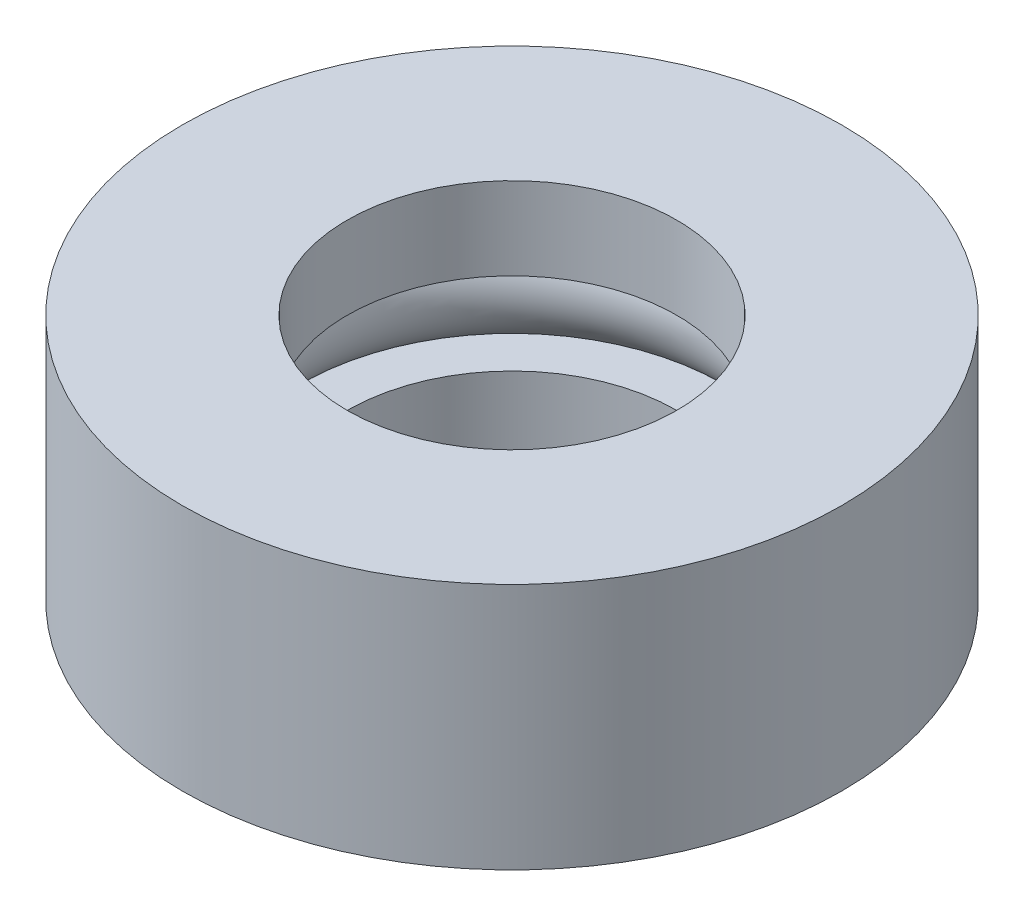
ISO-10303-21;
HEADER;
FILE_DESCRIPTION(('STEP AP214'),'2;1');
FILE_NAME('part.step','',(''),(''),'','','');
FILE_SCHEMA(('AUTOMOTIVE_DESIGN { 1 0 10303 214 1 1 1 1 }'));
ENDSEC;
DATA;
#1=APPLICATION_CONTEXT('core data for automotive mechanical design processes');
#2=APPLICATION_PROTOCOL_DEFINITION('international standard','automotive_design',2000,#1);
#3=PRODUCT_CONTEXT('',#1,'mechanical');
#4=PRODUCT('Part','Part','',(#3));
#5=PRODUCT_RELATED_PRODUCT_CATEGORY('part','',(#4));
#6=PRODUCT_DEFINITION_FORMATION('','',#4);
#7=PRODUCT_DEFINITION_CONTEXT('part definition',#1,'design');
#8=PRODUCT_DEFINITION('design','',#6,#7);
#9=PRODUCT_DEFINITION_SHAPE('','',#8);
#10=(LENGTH_UNIT() NAMED_UNIT(*) SI_UNIT(.MILLI.,.METRE.));
#11=(NAMED_UNIT(*) PLANE_ANGLE_UNIT() SI_UNIT($,.RADIAN.));
#12=(NAMED_UNIT(*) SI_UNIT($,.STERADIAN.) SOLID_ANGLE_UNIT());
#13=UNCERTAINTY_MEASURE_WITH_UNIT(LENGTH_MEASURE(1.E-05),#10,'distance_accuracy_value','');
#14=(GEOMETRIC_REPRESENTATION_CONTEXT(3) GLOBAL_UNCERTAINTY_ASSIGNED_CONTEXT((#13)) GLOBAL_UNIT_ASSIGNED_CONTEXT((#10,
#11,#12)) REPRESENTATION_CONTEXT('',''));
#15=CARTESIAN_POINT('',(0.,0.,0.));
#16=DIRECTION('',(0.,0.,1.));
#17=DIRECTION('',(1.,0.,0.));
#18=AXIS2_PLACEMENT_3D('',#15,#16,#17);
#19=CARTESIAN_POINT('',(0.,0.,0.));
#20=DIRECTION('',(0.,1.,0.));
#21=DIRECTION('',(0.,0.,1.));
#22=AXIS2_PLACEMENT_3D('',#19,#20,#21);
#23=TOROIDAL_SURFACE('',#22,4.5,1.);
#24=CARTESIAN_POINT('',(0.,0.75,0.));
#25=DIRECTION('',(0.,-1.,0.));
#26=DIRECTION('',(0.,0.,-1.));
#27=AXIS2_PLACEMENT_3D('',#24,#25,#26);
#28=CIRCLE('',#27,3.83856217223385);
#29=CARTESIAN_POINT('',(0.,0.75,-3.83856217223385));
#30=VERTEX_POINT('',#29);
#31=EDGE_CURVE('E49',#30,#30,#28,.F.);
#32=ORIENTED_EDGE('',*,*,#31,.T.);
#33=EDGE_LOOP('',(#32));
#34=FACE_BOUND('',#33,.T.);
#35=CARTESIAN_POINT('',(0.,-0.75,0.));
#36=DIRECTION('',(0.,1.,0.));
#37=DIRECTION('',(0.,0.,1.));
#38=AXIS2_PLACEMENT_3D('',#35,#36,#37);
#39=CIRCLE('',#38,3.83856217223385);
#40=CARTESIAN_POINT('',(0.,-0.75,3.83856217223385));
#41=VERTEX_POINT('',#40);
#42=EDGE_CURVE('E55',#41,#41,#39,.F.);
#43=ORIENTED_EDGE('',*,*,#42,.T.);
#44=EDGE_LOOP('',(#43));
#45=FACE_BOUND('',#44,.T.);
#46=ADVANCED_FACE('F31',(#34,#45),#23,.T.);
#47=CARTESIAN_POINT('',(0.,-0.75,0.));
#48=DIRECTION('',(0.,1.,0.));
#49=DIRECTION('',(0.,0.,1.));
#50=AXIS2_PLACEMENT_3D('',#47,#48,#49);
#51=CYLINDRICAL_SURFACE('',#50,6.);
#52=CARTESIAN_POINT('',(0.,2.25,0.));
#53=DIRECTION('',(0.,1.,0.));
#54=DIRECTION('',(0.,0.,1.));
#55=AXIS2_PLACEMENT_3D('',#52,#53,#54);
#56=CIRCLE('',#55,6.);
#57=CARTESIAN_POINT('',(0.,2.25,6.));
#58=VERTEX_POINT('',#57);
#59=EDGE_CURVE('E53',#58,#58,#56,.T.);
#60=ORIENTED_EDGE('',*,*,#59,.F.);
#61=EDGE_LOOP('',(#60));
#62=FACE_BOUND('',#61,.T.);
#63=CARTESIAN_POINT('',(0.,-2.25,0.));
#64=DIRECTION('',(0.,-1.,0.));
#65=DIRECTION('',(0.,0.,-1.));
#66=AXIS2_PLACEMENT_3D('',#63,#64,#65);
#67=CIRCLE('',#66,6.);
#68=CARTESIAN_POINT('',(0.,-2.25,-6.));
#69=VERTEX_POINT('',#68);
#70=EDGE_CURVE('E57',#69,#69,#67,.T.);
#71=ORIENTED_EDGE('',*,*,#70,.F.);
#72=EDGE_LOOP('',(#71));
#73=FACE_BOUND('',#72,.T.);
#74=ADVANCED_FACE('F114',(#62,#73),#51,.T.);
#75=CARTESIAN_POINT('',(0.,2.25,0.));
#76=DIRECTION('',(0.,-1.,0.));
#77=DIRECTION('',(0.,0.,-1.));
#78=AXIS2_PLACEMENT_3D('',#75,#76,#77);
#79=CYLINDRICAL_SURFACE('',#78,3.);
#80=CARTESIAN_POINT('',(0.,2.25,0.));
#81=DIRECTION('',(0.,1.,0.));
#82=DIRECTION('',(0.,0.,1.));
#83=AXIS2_PLACEMENT_3D('',#80,#81,#82);
#84=CIRCLE('',#83,3.);
#85=CARTESIAN_POINT('',(0.,2.25,3.));
#86=VERTEX_POINT('',#85);
#87=EDGE_CURVE('E72',#86,#86,#84,.T.);
#88=ORIENTED_EDGE('',*,*,#87,.T.);
#89=EDGE_LOOP('',(#88));
#90=FACE_BOUND('',#89,.T.);
#91=CARTESIAN_POINT('',(0.,0.75,0.));
#92=DIRECTION('',(0.,1.,0.));
#93=DIRECTION('',(0.,0.,1.));
#94=AXIS2_PLACEMENT_3D('',#91,#92,#93);
#95=CIRCLE('',#94,3.);
#96=CARTESIAN_POINT('',(0.,0.75,3.));
#97=VERTEX_POINT('',#96);
#98=EDGE_CURVE('E75',#97,#97,#95,.T.);
#99=ORIENTED_EDGE('',*,*,#98,.F.);
#100=EDGE_LOOP('',(#99));
#101=FACE_BOUND('',#100,.T.);
#102=ADVANCED_FACE('F119',(#90,#101),#79,.F.);
#103=CARTESIAN_POINT('',(0.,2.25,0.));
#104=DIRECTION('',(0.,1.,0.));
#105=DIRECTION('',(0.,0.,1.));
#106=AXIS2_PLACEMENT_3D('',#103,#104,#105);
#107=PLANE('',#106);
#108=ORIENTED_EDGE('',*,*,#59,.T.);
#109=EDGE_LOOP('',(#108));
#110=FACE_BOUND('',#109,.T.);
#111=ORIENTED_EDGE('',*,*,#87,.F.);
#112=EDGE_LOOP('',(#111));
#113=FACE_BOUND('',#112,.T.);
#114=ADVANCED_FACE('F125',(#110,#113),#107,.T.);
#115=CARTESIAN_POINT('',(0.,0.75,0.));
#116=DIRECTION('',(0.,1.,0.));
#117=DIRECTION('',(0.,0.,1.));
#118=AXIS2_PLACEMENT_3D('',#115,#116,#117);
#119=PLANE('',#118);
#120=ORIENTED_EDGE('',*,*,#98,.T.);
#121=EDGE_LOOP('',(#120));
#122=FACE_BOUND('',#121,.T.);
#123=ORIENTED_EDGE('',*,*,#31,.F.);
#124=EDGE_LOOP('',(#123));
#125=FACE_BOUND('',#124,.T.);
#126=ADVANCED_FACE('F98',(#122,#125),#119,.F.);
#127=CARTESIAN_POINT('',(0.,-2.25,0.));
#128=DIRECTION('',(0.,1.,0.));
#129=DIRECTION('',(0.,0.,1.));
#130=AXIS2_PLACEMENT_3D('',#127,#128,#129);
#131=CYLINDRICAL_SURFACE('',#130,3.);
#132=CARTESIAN_POINT('',(0.,-2.25,0.));
#133=DIRECTION('',(0.,-1.,0.));
#134=DIRECTION('',(0.,0.,-1.));
#135=AXIS2_PLACEMENT_3D('',#132,#133,#134);
#136=CIRCLE('',#135,3.);
#137=CARTESIAN_POINT('',(0.,-2.25,-3.));
#138=VERTEX_POINT('',#137);
#139=EDGE_CURVE('E63',#138,#138,#136,.T.);
#140=ORIENTED_EDGE('',*,*,#139,.T.);
#141=EDGE_LOOP('',(#140));
#142=FACE_BOUND('',#141,.T.);
#143=CARTESIAN_POINT('',(0.,-0.75,0.));
#144=DIRECTION('',(0.,-1.,0.));
#145=DIRECTION('',(0.,0.,-1.));
#146=AXIS2_PLACEMENT_3D('',#143,#144,#145);
#147=CIRCLE('',#146,3.);
#148=CARTESIAN_POINT('',(0.,-0.75,-3.));
#149=VERTEX_POINT('',#148);
#150=EDGE_CURVE('E68',#149,#149,#147,.T.);
#151=ORIENTED_EDGE('',*,*,#150,.F.);
#152=EDGE_LOOP('',(#151));
#153=FACE_BOUND('',#152,.T.);
#154=ADVANCED_FACE('F124',(#142,#153),#131,.F.);
#155=CARTESIAN_POINT('',(0.,-2.25,0.));
#156=DIRECTION('',(0.,-1.,0.));
#157=DIRECTION('',(0.,0.,-1.));
#158=AXIS2_PLACEMENT_3D('',#155,#156,#157);
#159=PLANE('',#158);
#160=ORIENTED_EDGE('',*,*,#70,.T.);
#161=EDGE_LOOP('',(#160));
#162=FACE_BOUND('',#161,.T.);
#163=ORIENTED_EDGE('',*,*,#139,.F.);
#164=EDGE_LOOP('',(#163));
#165=FACE_BOUND('',#164,.T.);
#166=ADVANCED_FACE('F131',(#162,#165),#159,.T.);
#167=CARTESIAN_POINT('',(0.,-0.75,0.));
#168=DIRECTION('',(0.,-1.,0.));
#169=DIRECTION('',(0.,0.,-1.));
#170=AXIS2_PLACEMENT_3D('',#167,#168,#169);
#171=PLANE('',#170);
#172=ORIENTED_EDGE('',*,*,#150,.T.);
#173=EDGE_LOOP('',(#172));
#174=FACE_BOUND('',#173,.T.);
#175=ORIENTED_EDGE('',*,*,#42,.F.);
#176=EDGE_LOOP('',(#175));
#177=FACE_BOUND('',#176,.T.);
#178=ADVANCED_FACE('F143',(#174,#177),#171,.F.);
#179=CLOSED_SHELL('',(#46,#74,#102,#114,#126,#154,#166,#178));
#180=CARTESIAN_POINT('',(0.,-0.661437827766146,0.));
#181=DIRECTION('',(0.,1.,0.));
#182=DIRECTION('',(0.,0.,1.));
#183=AXIS2_PLACEMENT_3D('',#180,#181,#182);
#184=CIRCLE('',#183,5.25);
#185=CARTESIAN_POINT('',(0.,-0.661437827766146,5.25));
#186=VERTEX_POINT('',#185);
#187=EDGE_CURVE('E40',#186,#186,#184,.T.);
#188=ORIENTED_EDGE('',*,*,#187,.F.);
#189=EDGE_LOOP('',(#188));
#190=FACE_BOUND('',#189,.T.);
#191=CARTESIAN_POINT('',(0.,-0.75,0.));
#192=DIRECTION('',(0.,-1.,0.));
#193=DIRECTION('',(0.,0.,-1.));
#194=AXIS2_PLACEMENT_3D('',#191,#192,#193);
#195=CIRCLE('',#194,5.16143782776615);
#196=CARTESIAN_POINT('',(0.,-0.75,-5.16143782776615));
#197=VERTEX_POINT('',#196);
#198=EDGE_CURVE('E35',#197,#197,#195,.F.);
#199=ORIENTED_EDGE('',*,*,#198,.T.);
#200=EDGE_LOOP('',(#199));
#201=FACE_BOUND('',#200,.T.);
#202=ADVANCED_FACE('F100',(#190,#201),#23,.T.);
#203=CARTESIAN_POINT('',(0.,-0.75,0.));
#204=DIRECTION('',(0.,1.,0.));
#205=DIRECTION('',(0.,0.,1.));
#206=AXIS2_PLACEMENT_3D('',#203,#204,#205);
#207=CYLINDRICAL_SURFACE('',#206,5.25);
#208=ORIENTED_EDGE('',*,*,#187,.T.);
#209=EDGE_LOOP('',(#208));
#210=FACE_BOUND('',#209,.T.);
#211=CARTESIAN_POINT('',(0.,-0.75,0.));
#212=DIRECTION('',(0.,-1.,0.));
#213=DIRECTION('',(0.,0.,-1.));
#214=AXIS2_PLACEMENT_3D('',#211,#212,#213);
#215=CIRCLE('',#214,5.25);
#216=CARTESIAN_POINT('',(0.,-0.75,-5.25));
#217=VERTEX_POINT('',#216);
#218=EDGE_CURVE('E61',#217,#217,#215,.T.);
#219=ORIENTED_EDGE('',*,*,#218,.T.);
#220=EDGE_LOOP('',(#219));
#221=FACE_BOUND('',#220,.T.);
#222=ADVANCED_FACE('F91',(#210,#221),#207,.F.);
#223=ORIENTED_EDGE('',*,*,#198,.F.);
#224=EDGE_LOOP('',(#223));
#225=FACE_BOUND('',#224,.T.);
#226=ORIENTED_EDGE('',*,*,#218,.F.);
#227=EDGE_LOOP('',(#226));
#228=FACE_BOUND('',#227,.T.);
#229=ADVANCED_FACE('F102',(#225,#228),#171,.F.);
#230=CLOSED_SHELL('',(#202,#222,#229));
#231=CARTESIAN_POINT('',(0.,0.661437827766146,0.));
#232=DIRECTION('',(0.,-1.,0.));
#233=DIRECTION('',(0.,0.,-1.));
#234=AXIS2_PLACEMENT_3D('',#231,#232,#233);
#235=CIRCLE('',#234,5.25);
#236=CARTESIAN_POINT('',(0.,0.661437827766146,-5.25));
#237=VERTEX_POINT('',#236);
#238=EDGE_CURVE('E10',#237,#237,#235,.T.);
#239=ORIENTED_EDGE('',*,*,#238,.F.);
#240=EDGE_LOOP('',(#239));
#241=FACE_BOUND('',#240,.T.);
#242=CARTESIAN_POINT('',(0.,0.75,0.));
#243=DIRECTION('',(0.,1.,0.));
#244=DIRECTION('',(0.,0.,1.));
#245=AXIS2_PLACEMENT_3D('',#242,#243,#244);
#246=CIRCLE('',#245,5.16143782776615);
#247=CARTESIAN_POINT('',(0.,0.75,5.16143782776615));
#248=VERTEX_POINT('',#247);
#249=EDGE_CURVE('E52',#248,#248,#246,.F.);
#250=ORIENTED_EDGE('',*,*,#249,.T.);
#251=EDGE_LOOP('',(#250));
#252=FACE_BOUND('',#251,.T.);
#253=ADVANCED_FACE('F33',(#241,#252),#23,.T.);
#254=ORIENTED_EDGE('',*,*,#238,.T.);
#255=EDGE_LOOP('',(#254));
#256=FACE_BOUND('',#255,.T.);
#257=CARTESIAN_POINT('',(0.,0.75,0.));
#258=DIRECTION('',(0.,-1.,0.));
#259=DIRECTION('',(0.,0.,-1.));
#260=AXIS2_PLACEMENT_3D('',#257,#258,#259);
#261=CIRCLE('',#260,5.25);
#262=CARTESIAN_POINT('',(0.,0.75,-5.25));
#263=VERTEX_POINT('',#262);
#264=EDGE_CURVE('E45',#263,#263,#261,.T.);
#265=ORIENTED_EDGE('',*,*,#264,.F.);
#266=EDGE_LOOP('',(#265));
#267=FACE_BOUND('',#266,.T.);
#268=ADVANCED_FACE('F87',(#256,#267),#207,.F.);
#269=ORIENTED_EDGE('',*,*,#264,.T.);
#270=EDGE_LOOP('',(#269));
#271=FACE_BOUND('',#270,.T.);
#272=ORIENTED_EDGE('',*,*,#249,.F.);
#273=EDGE_LOOP('',(#272));
#274=FACE_BOUND('',#273,.T.);
#275=ADVANCED_FACE('F84',(#271,#274),#119,.F.);
#276=CLOSED_SHELL('',(#253,#268,#275));
#277=ORIENTED_CLOSED_SHELL('',*,#230,.T.);
#278=ORIENTED_CLOSED_SHELL('',*,#276,.T.);
#279=BREP_WITH_VOIDS('B2',#179,(#277,#278));
#280=ADVANCED_BREP_SHAPE_REPRESENTATION('',(#18,#279),#14);
#281=SHAPE_DEFINITION_REPRESENTATION(#9,#280);
ENDSEC;
END-ISO-10303-21;
